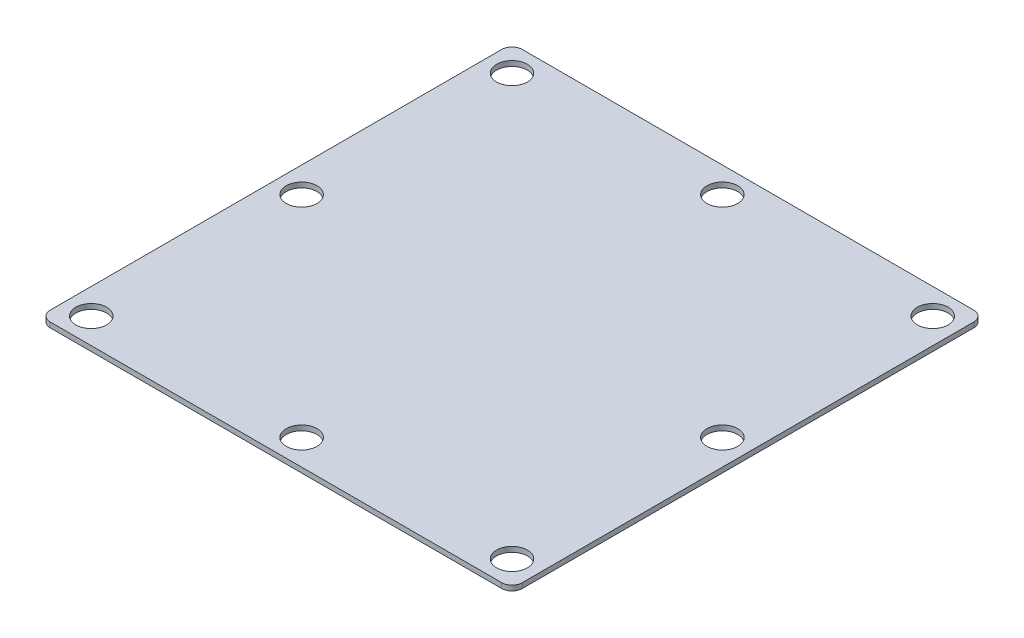
ISO-10303-21;
HEADER;
FILE_DESCRIPTION(('STEP AP214'),'2;1');
FILE_NAME('part.step','',(''),(''),'','','');
FILE_SCHEMA(('AUTOMOTIVE_DESIGN { 1 0 10303 214 1 1 1 1 }'));
ENDSEC;
DATA;
#1=APPLICATION_CONTEXT('core data for automotive mechanical design processes');
#2=APPLICATION_PROTOCOL_DEFINITION('international standard','automotive_design',2000,#1);
#3=PRODUCT_CONTEXT('',#1,'mechanical');
#4=PRODUCT('Part','Part','',(#3));
#5=PRODUCT_RELATED_PRODUCT_CATEGORY('part','',(#4));
#6=PRODUCT_DEFINITION_FORMATION('','',#4);
#7=PRODUCT_DEFINITION_CONTEXT('part definition',#1,'design');
#8=PRODUCT_DEFINITION('design','',#6,#7);
#9=PRODUCT_DEFINITION_SHAPE('','',#8);
#10=(LENGTH_UNIT() NAMED_UNIT(*) SI_UNIT(.MILLI.,.METRE.));
#11=(NAMED_UNIT(*) PLANE_ANGLE_UNIT() SI_UNIT($,.RADIAN.));
#12=(NAMED_UNIT(*) SI_UNIT($,.STERADIAN.) SOLID_ANGLE_UNIT());
#13=UNCERTAINTY_MEASURE_WITH_UNIT(LENGTH_MEASURE(1.E-05),#10,'distance_accuracy_value','');
#14=(GEOMETRIC_REPRESENTATION_CONTEXT(3) GLOBAL_UNCERTAINTY_ASSIGNED_CONTEXT((#13)) GLOBAL_UNIT_ASSIGNED_CONTEXT((#10,
#11,#12)) REPRESENTATION_CONTEXT('',''));
#15=CARTESIAN_POINT('',(0.,0.,0.));
#16=DIRECTION('',(0.,0.,1.));
#17=DIRECTION('',(1.,0.,0.));
#18=AXIS2_PLACEMENT_3D('',#15,#16,#17);
#19=CARTESIAN_POINT('',(46.,0.5,46.));
#20=DIRECTION('',(-1.,0.,0.));
#21=DIRECTION('',(0.,0.,1.));
#22=AXIS2_PLACEMENT_3D('',#19,#20,#21);
#23=PLANE('',#22);
#24=DIRECTION('',(0.,0.,-1.));
#25=VECTOR('',#24,1.);
#26=CARTESIAN_POINT('',(46.,0.5,46.));
#27=LINE('',#26,#25);
#28=CARTESIAN_POINT('',(46.,0.5,44.));
#29=VERTEX_POINT('',#28);
#30=CARTESIAN_POINT('',(46.,0.5,-44.));
#31=VERTEX_POINT('',#30);
#32=EDGE_CURVE('E118',#29,#31,#27,.T.);
#33=ORIENTED_EDGE('',*,*,#32,.F.);
#34=DIRECTION('',(0.,-1.,0.));
#35=VECTOR('',#34,1.);
#36=CARTESIAN_POINT('',(46.,0.5,44.));
#37=LINE('',#36,#35);
#38=CARTESIAN_POINT('',(46.,-0.5,44.));
#39=VERTEX_POINT('',#38);
#40=EDGE_CURVE('E103',#29,#39,#37,.T.);
#41=ORIENTED_EDGE('',*,*,#40,.T.);
#42=DIRECTION('',(0.,0.,-1.));
#43=VECTOR('',#42,1.);
#44=CARTESIAN_POINT('',(46.,-0.5,46.));
#45=LINE('',#44,#43);
#46=CARTESIAN_POINT('',(46.,-0.5,-44.));
#47=VERTEX_POINT('',#46);
#48=EDGE_CURVE('E115',#39,#47,#45,.T.);
#49=ORIENTED_EDGE('',*,*,#48,.T.);
#50=DIRECTION('',(0.,-1.,0.));
#51=VECTOR('',#50,1.);
#52=CARTESIAN_POINT('',(46.,0.5,-44.));
#53=LINE('',#52,#51);
#54=EDGE_CURVE('E120',#47,#31,#53,.F.);
#55=ORIENTED_EDGE('',*,*,#54,.T.);
#56=EDGE_LOOP('',(#33,#41,#49,#55));
#57=FACE_BOUND('',#56,.T.);
#58=ADVANCED_FACE('F33',(#57),#23,.F.);
#59=CARTESIAN_POINT('',(-46.,0.5,-46.));
#60=DIRECTION('',(0.,0.,1.));
#61=DIRECTION('',(1.,0.,0.));
#62=AXIS2_PLACEMENT_3D('',#59,#60,#61);
#63=PLANE('',#62);
#64=DIRECTION('',(-1.,0.,0.));
#65=VECTOR('',#64,1.);
#66=CARTESIAN_POINT('',(-46.,-0.5,-46.));
#67=LINE('',#66,#65);
#68=CARTESIAN_POINT('',(44.,-0.5,-46.));
#69=VERTEX_POINT('',#68);
#70=CARTESIAN_POINT('',(-44.,-0.5,-46.));
#71=VERTEX_POINT('',#70);
#72=EDGE_CURVE('E125',#69,#71,#67,.T.);
#73=ORIENTED_EDGE('',*,*,#72,.T.);
#74=DIRECTION('',(0.,-1.,0.));
#75=VECTOR('',#74,1.);
#76=CARTESIAN_POINT('',(-44.,0.5,-46.));
#77=LINE('',#76,#75);
#78=CARTESIAN_POINT('',(-44.,0.5,-46.));
#79=VERTEX_POINT('',#78);
#80=EDGE_CURVE('E11',#71,#79,#77,.F.);
#81=ORIENTED_EDGE('',*,*,#80,.T.);
#82=DIRECTION('',(-1.,0.,0.));
#83=VECTOR('',#82,1.);
#84=CARTESIAN_POINT('',(-46.,0.5,-46.));
#85=LINE('',#84,#83);
#86=CARTESIAN_POINT('',(44.,0.5,-46.));
#87=VERTEX_POINT('',#86);
#88=EDGE_CURVE('E164',#87,#79,#85,.T.);
#89=ORIENTED_EDGE('',*,*,#88,.F.);
#90=DIRECTION('',(0.,-1.,0.));
#91=VECTOR('',#90,1.);
#92=CARTESIAN_POINT('',(44.,0.5,-46.));
#93=LINE('',#92,#91);
#94=EDGE_CURVE('E41',#87,#69,#93,.T.);
#95=ORIENTED_EDGE('',*,*,#94,.T.);
#96=EDGE_LOOP('',(#73,#81,#89,#95));
#97=FACE_BOUND('',#96,.T.);
#98=ADVANCED_FACE('F162',(#97),#63,.F.);
#99=CARTESIAN_POINT('',(-46.,0.5,46.));
#100=DIRECTION('',(1.,0.,0.));
#101=DIRECTION('',(0.,0.,-1.));
#102=AXIS2_PLACEMENT_3D('',#99,#100,#101);
#103=PLANE('',#102);
#104=DIRECTION('',(0.,0.,1.));
#105=VECTOR('',#104,1.);
#106=CARTESIAN_POINT('',(-46.,0.5,46.));
#107=LINE('',#106,#105);
#108=CARTESIAN_POINT('',(-46.,0.5,-44.));
#109=VERTEX_POINT('',#108);
#110=CARTESIAN_POINT('',(-46.,0.5,44.));
#111=VERTEX_POINT('',#110);
#112=EDGE_CURVE('E172',#109,#111,#107,.T.);
#113=ORIENTED_EDGE('',*,*,#112,.F.);
#114=DIRECTION('',(0.,-1.,0.));
#115=VECTOR('',#114,1.);
#116=CARTESIAN_POINT('',(-46.,0.5,-44.));
#117=LINE('',#116,#115);
#118=CARTESIAN_POINT('',(-46.,-0.5,-44.));
#119=VERTEX_POINT('',#118);
#120=EDGE_CURVE('E156',#109,#119,#117,.T.);
#121=ORIENTED_EDGE('',*,*,#120,.T.);
#122=DIRECTION('',(0.,0.,1.));
#123=VECTOR('',#122,1.);
#124=CARTESIAN_POINT('',(-46.,-0.5,46.));
#125=LINE('',#124,#123);
#126=CARTESIAN_POINT('',(-46.,-0.5,44.));
#127=VERTEX_POINT('',#126);
#128=EDGE_CURVE('E129',#119,#127,#125,.T.);
#129=ORIENTED_EDGE('',*,*,#128,.T.);
#130=DIRECTION('',(0.,-1.,0.));
#131=VECTOR('',#130,1.);
#132=CARTESIAN_POINT('',(-46.,0.5,44.));
#133=LINE('',#132,#131);
#134=EDGE_CURVE('E48',#127,#111,#133,.F.);
#135=ORIENTED_EDGE('',*,*,#134,.T.);
#136=EDGE_LOOP('',(#113,#121,#129,#135));
#137=FACE_BOUND('',#136,.T.);
#138=ADVANCED_FACE('F171',(#137),#103,.F.);
#139=CARTESIAN_POINT('',(-46.,0.5,46.));
#140=DIRECTION('',(0.,0.,-1.));
#141=DIRECTION('',(-1.,0.,0.));
#142=AXIS2_PLACEMENT_3D('',#139,#140,#141);
#143=PLANE('',#142);
#144=DIRECTION('',(1.,0.,0.));
#145=VECTOR('',#144,1.);
#146=CARTESIAN_POINT('',(-46.,-0.5,46.));
#147=LINE('',#146,#145);
#148=CARTESIAN_POINT('',(-44.,-0.5,46.));
#149=VERTEX_POINT('',#148);
#150=CARTESIAN_POINT('',(44.,-0.5,46.));
#151=VERTEX_POINT('',#150);
#152=EDGE_CURVE('E139',#149,#151,#147,.T.);
#153=ORIENTED_EDGE('',*,*,#152,.T.);
#154=DIRECTION('',(0.,-1.,0.));
#155=VECTOR('',#154,1.);
#156=CARTESIAN_POINT('',(44.,0.5,46.));
#157=LINE('',#156,#155);
#158=CARTESIAN_POINT('',(44.,0.5,46.));
#159=VERTEX_POINT('',#158);
#160=EDGE_CURVE('E104',#151,#159,#157,.F.);
#161=ORIENTED_EDGE('',*,*,#160,.T.);
#162=DIRECTION('',(1.,0.,0.));
#163=VECTOR('',#162,1.);
#164=CARTESIAN_POINT('',(-46.,0.5,46.));
#165=LINE('',#164,#163);
#166=CARTESIAN_POINT('',(-44.,0.5,46.));
#167=VERTEX_POINT('',#166);
#168=EDGE_CURVE('E135',#167,#159,#165,.T.);
#169=ORIENTED_EDGE('',*,*,#168,.F.);
#170=DIRECTION('',(0.,-1.,0.));
#171=VECTOR('',#170,1.);
#172=CARTESIAN_POINT('',(-44.,0.5,46.));
#173=LINE('',#172,#171);
#174=EDGE_CURVE('E109',#167,#149,#173,.T.);
#175=ORIENTED_EDGE('',*,*,#174,.T.);
#176=EDGE_LOOP('',(#153,#161,#169,#175));
#177=FACE_BOUND('',#176,.T.);
#178=ADVANCED_FACE('F236',(#177),#143,.F.);
#179=CARTESIAN_POINT('',(0.,0.5,0.));
#180=DIRECTION('',(0.,-1.,0.));
#181=DIRECTION('',(0.,0.,-1.));
#182=AXIS2_PLACEMENT_3D('',#179,#180,#181);
#183=PLANE('',#182);
#184=CARTESIAN_POINT('',(0.,0.5,-41.));
#185=DIRECTION('',(0.,-1.,0.));
#186=DIRECTION('',(0.,0.,-1.));
#187=AXIS2_PLACEMENT_3D('',#184,#185,#186);
#188=CIRCLE('',#187,3.);
#189=CARTESIAN_POINT('',(0.,0.5,-44.));
#190=VERTEX_POINT('',#189);
#191=EDGE_CURVE('E126',#190,#190,#188,.T.);
#192=ORIENTED_EDGE('',*,*,#191,.T.);
#193=EDGE_LOOP('',(#192));
#194=FACE_BOUND('',#193,.T.);
#195=CARTESIAN_POINT('',(41.,0.5,-41.));
#196=DIRECTION('',(0.,-1.,0.));
#197=DIRECTION('',(0.,0.,-1.));
#198=AXIS2_PLACEMENT_3D('',#195,#196,#197);
#199=CIRCLE('',#198,3.);
#200=CARTESIAN_POINT('',(41.,0.5,-44.));
#201=VERTEX_POINT('',#200);
#202=EDGE_CURVE('E132',#201,#201,#199,.T.);
#203=ORIENTED_EDGE('',*,*,#202,.T.);
#204=EDGE_LOOP('',(#203));
#205=FACE_BOUND('',#204,.T.);
#206=CARTESIAN_POINT('',(41.,0.5,0.));
#207=DIRECTION('',(0.,-1.,0.));
#208=DIRECTION('',(0.,0.,-1.));
#209=AXIS2_PLACEMENT_3D('',#206,#207,#208);
#210=CIRCLE('',#209,3.);
#211=CARTESIAN_POINT('',(41.,0.5,-3.));
#212=VERTEX_POINT('',#211);
#213=EDGE_CURVE('E180',#212,#212,#210,.T.);
#214=ORIENTED_EDGE('',*,*,#213,.T.);
#215=EDGE_LOOP('',(#214));
#216=FACE_BOUND('',#215,.T.);
#217=CARTESIAN_POINT('',(41.,0.5,41.));
#218=DIRECTION('',(0.,-1.,0.));
#219=DIRECTION('',(0.,0.,-1.));
#220=AXIS2_PLACEMENT_3D('',#217,#218,#219);
#221=CIRCLE('',#220,3.);
#222=CARTESIAN_POINT('',(41.,0.5,38.));
#223=VERTEX_POINT('',#222);
#224=EDGE_CURVE('E183',#223,#223,#221,.T.);
#225=ORIENTED_EDGE('',*,*,#224,.T.);
#226=EDGE_LOOP('',(#225));
#227=FACE_BOUND('',#226,.T.);
#228=CARTESIAN_POINT('',(0.,0.5,41.));
#229=DIRECTION('',(0.,-1.,0.));
#230=DIRECTION('',(0.,0.,-1.));
#231=AXIS2_PLACEMENT_3D('',#228,#229,#230);
#232=CIRCLE('',#231,3.);
#233=CARTESIAN_POINT('',(0.,0.5,38.));
#234=VERTEX_POINT('',#233);
#235=EDGE_CURVE('E186',#234,#234,#232,.T.);
#236=ORIENTED_EDGE('',*,*,#235,.T.);
#237=EDGE_LOOP('',(#236));
#238=FACE_BOUND('',#237,.T.);
#239=CARTESIAN_POINT('',(-41.,0.5,41.));
#240=DIRECTION('',(0.,-1.,0.));
#241=DIRECTION('',(0.,0.,-1.));
#242=AXIS2_PLACEMENT_3D('',#239,#240,#241);
#243=CIRCLE('',#242,3.);
#244=CARTESIAN_POINT('',(-41.,0.5,38.));
#245=VERTEX_POINT('',#244);
#246=EDGE_CURVE('E189',#245,#245,#243,.T.);
#247=ORIENTED_EDGE('',*,*,#246,.T.);
#248=EDGE_LOOP('',(#247));
#249=FACE_BOUND('',#248,.T.);
#250=CARTESIAN_POINT('',(-41.,0.5,0.));
#251=DIRECTION('',(0.,-1.,0.));
#252=DIRECTION('',(0.,0.,-1.));
#253=AXIS2_PLACEMENT_3D('',#250,#251,#252);
#254=CIRCLE('',#253,3.);
#255=CARTESIAN_POINT('',(-41.,0.5,-3.));
#256=VERTEX_POINT('',#255);
#257=EDGE_CURVE('E192',#256,#256,#254,.T.);
#258=ORIENTED_EDGE('',*,*,#257,.T.);
#259=EDGE_LOOP('',(#258));
#260=FACE_BOUND('',#259,.T.);
#261=CARTESIAN_POINT('',(-41.,0.5,-41.));
#262=DIRECTION('',(0.,-1.,0.));
#263=DIRECTION('',(0.,0.,-1.));
#264=AXIS2_PLACEMENT_3D('',#261,#262,#263);
#265=CIRCLE('',#264,3.);
#266=CARTESIAN_POINT('',(-41.,0.5,-44.));
#267=VERTEX_POINT('',#266);
#268=EDGE_CURVE('E195',#267,#267,#265,.T.);
#269=ORIENTED_EDGE('',*,*,#268,.T.);
#270=EDGE_LOOP('',(#269));
#271=FACE_BOUND('',#270,.T.);
#272=ORIENTED_EDGE('',*,*,#168,.T.);
#273=CARTESIAN_POINT('',(44.,0.5,44.));
#274=DIRECTION('',(0.,-1.,0.));
#275=DIRECTION('',(0.,0.,-1.));
#276=AXIS2_PLACEMENT_3D('',#273,#274,#275);
#277=CIRCLE('',#276,2.);
#278=EDGE_CURVE('E153',#159,#29,#277,.F.);
#279=ORIENTED_EDGE('',*,*,#278,.T.);
#280=ORIENTED_EDGE('',*,*,#32,.T.);
#281=CARTESIAN_POINT('',(44.,0.5,-44.));
#282=DIRECTION('',(0.,-1.,0.));
#283=DIRECTION('',(0.,0.,-1.));
#284=AXIS2_PLACEMENT_3D('',#281,#282,#283);
#285=CIRCLE('',#284,2.);
#286=EDGE_CURVE('E150',#31,#87,#285,.F.);
#287=ORIENTED_EDGE('',*,*,#286,.T.);
#288=ORIENTED_EDGE('',*,*,#88,.T.);
#289=CARTESIAN_POINT('',(-44.,0.5,-44.));
#290=DIRECTION('',(0.,-1.,0.));
#291=DIRECTION('',(0.,0.,-1.));
#292=AXIS2_PLACEMENT_3D('',#289,#290,#291);
#293=CIRCLE('',#292,2.);
#294=EDGE_CURVE('E55',#79,#109,#293,.F.);
#295=ORIENTED_EDGE('',*,*,#294,.T.);
#296=ORIENTED_EDGE('',*,*,#112,.T.);
#297=CARTESIAN_POINT('',(-44.,0.5,44.));
#298=DIRECTION('',(0.,-1.,0.));
#299=DIRECTION('',(0.,0.,-1.));
#300=AXIS2_PLACEMENT_3D('',#297,#298,#299);
#301=CIRCLE('',#300,2.);
#302=EDGE_CURVE('E148',#111,#167,#301,.F.);
#303=ORIENTED_EDGE('',*,*,#302,.T.);
#304=EDGE_LOOP('',(#272,#279,#280,#287,#288,#295,#296,#303));
#305=FACE_BOUND('',#304,.T.);
#306=ADVANCED_FACE('F233',(#194,#205,#216,#227,#238,#249,#260,#271,#305),#183,.F.);
#307=CARTESIAN_POINT('',(0.,-0.5,0.));
#308=DIRECTION('',(0.,-1.,0.));
#309=DIRECTION('',(0.,0.,-1.));
#310=AXIS2_PLACEMENT_3D('',#307,#308,#309);
#311=PLANE('',#310);
#312=CARTESIAN_POINT('',(0.,-0.5,-41.));
#313=DIRECTION('',(0.,1.,0.));
#314=DIRECTION('',(0.,0.,1.));
#315=AXIS2_PLACEMENT_3D('',#312,#313,#314);
#316=CIRCLE('',#315,3.);
#317=CARTESIAN_POINT('',(0.,-0.5,-38.));
#318=VERTEX_POINT('',#317);
#319=EDGE_CURVE('E201',#318,#318,#316,.T.);
#320=ORIENTED_EDGE('',*,*,#319,.T.);
#321=EDGE_LOOP('',(#320));
#322=FACE_BOUND('',#321,.T.);
#323=CARTESIAN_POINT('',(41.,-0.5,-41.));
#324=DIRECTION('',(0.,1.,0.));
#325=DIRECTION('',(0.,0.,1.));
#326=AXIS2_PLACEMENT_3D('',#323,#324,#325);
#327=CIRCLE('',#326,3.);
#328=CARTESIAN_POINT('',(41.,-0.5,-38.));
#329=VERTEX_POINT('',#328);
#330=EDGE_CURVE('E209',#329,#329,#327,.T.);
#331=ORIENTED_EDGE('',*,*,#330,.T.);
#332=EDGE_LOOP('',(#331));
#333=FACE_BOUND('',#332,.T.);
#334=CARTESIAN_POINT('',(41.,-0.5,0.));
#335=DIRECTION('',(0.,1.,0.));
#336=DIRECTION('',(0.,0.,1.));
#337=AXIS2_PLACEMENT_3D('',#334,#335,#336);
#338=CIRCLE('',#337,3.);
#339=CARTESIAN_POINT('',(41.,-0.5,3.));
#340=VERTEX_POINT('',#339);
#341=EDGE_CURVE('E205',#340,#340,#338,.T.);
#342=ORIENTED_EDGE('',*,*,#341,.T.);
#343=EDGE_LOOP('',(#342));
#344=FACE_BOUND('',#343,.T.);
#345=CARTESIAN_POINT('',(41.,-0.5,41.));
#346=DIRECTION('',(0.,1.,0.));
#347=DIRECTION('',(0.,0.,1.));
#348=AXIS2_PLACEMENT_3D('',#345,#346,#347);
#349=CIRCLE('',#348,3.);
#350=CARTESIAN_POINT('',(41.,-0.5,44.));
#351=VERTEX_POINT('',#350);
#352=EDGE_CURVE('E202',#351,#351,#349,.T.);
#353=ORIENTED_EDGE('',*,*,#352,.T.);
#354=EDGE_LOOP('',(#353));
#355=FACE_BOUND('',#354,.T.);
#356=CARTESIAN_POINT('',(0.,-0.5,41.));
#357=DIRECTION('',(0.,1.,0.));
#358=DIRECTION('',(0.,0.,1.));
#359=AXIS2_PLACEMENT_3D('',#356,#357,#358);
#360=CIRCLE('',#359,3.);
#361=CARTESIAN_POINT('',(0.,-0.5,44.));
#362=VERTEX_POINT('',#361);
#363=EDGE_CURVE('E206',#362,#362,#360,.T.);
#364=ORIENTED_EDGE('',*,*,#363,.T.);
#365=EDGE_LOOP('',(#364));
#366=FACE_BOUND('',#365,.T.);
#367=CARTESIAN_POINT('',(-41.,-0.5,41.));
#368=DIRECTION('',(0.,1.,0.));
#369=DIRECTION('',(0.,0.,1.));
#370=AXIS2_PLACEMENT_3D('',#367,#368,#369);
#371=CIRCLE('',#370,3.);
#372=CARTESIAN_POINT('',(-41.,-0.5,44.));
#373=VERTEX_POINT('',#372);
#374=EDGE_CURVE('E217',#373,#373,#371,.T.);
#375=ORIENTED_EDGE('',*,*,#374,.T.);
#376=EDGE_LOOP('',(#375));
#377=FACE_BOUND('',#376,.T.);
#378=CARTESIAN_POINT('',(-41.,-0.5,0.));
#379=DIRECTION('',(0.,1.,0.));
#380=DIRECTION('',(0.,0.,1.));
#381=AXIS2_PLACEMENT_3D('',#378,#379,#380);
#382=CIRCLE('',#381,3.);
#383=CARTESIAN_POINT('',(-41.,-0.5,3.));
#384=VERTEX_POINT('',#383);
#385=EDGE_CURVE('E214',#384,#384,#382,.T.);
#386=ORIENTED_EDGE('',*,*,#385,.T.);
#387=EDGE_LOOP('',(#386));
#388=FACE_BOUND('',#387,.T.);
#389=CARTESIAN_POINT('',(-41.,-0.5,-41.));
#390=DIRECTION('',(0.,1.,0.));
#391=DIRECTION('',(0.,0.,1.));
#392=AXIS2_PLACEMENT_3D('',#389,#390,#391);
#393=CIRCLE('',#392,3.);
#394=CARTESIAN_POINT('',(-41.,-0.5,-38.));
#395=VERTEX_POINT('',#394);
#396=EDGE_CURVE('E198',#395,#395,#393,.T.);
#397=ORIENTED_EDGE('',*,*,#396,.T.);
#398=EDGE_LOOP('',(#397));
#399=FACE_BOUND('',#398,.T.);
#400=ORIENTED_EDGE('',*,*,#48,.F.);
#401=CARTESIAN_POINT('',(44.,-0.5,44.));
#402=DIRECTION('',(0.,-1.,0.));
#403=DIRECTION('',(0.,0.,-1.));
#404=AXIS2_PLACEMENT_3D('',#401,#402,#403);
#405=CIRCLE('',#404,2.);
#406=EDGE_CURVE('E99',#39,#151,#405,.T.);
#407=ORIENTED_EDGE('',*,*,#406,.T.);
#408=ORIENTED_EDGE('',*,*,#152,.F.);
#409=CARTESIAN_POINT('',(-44.,-0.5,44.));
#410=DIRECTION('',(0.,-1.,0.));
#411=DIRECTION('',(0.,0.,-1.));
#412=AXIS2_PLACEMENT_3D('',#409,#410,#411);
#413=CIRCLE('',#412,2.);
#414=EDGE_CURVE('E119',#149,#127,#413,.T.);
#415=ORIENTED_EDGE('',*,*,#414,.T.);
#416=ORIENTED_EDGE('',*,*,#128,.F.);
#417=CARTESIAN_POINT('',(-44.,-0.5,-44.));
#418=DIRECTION('',(0.,-1.,0.));
#419=DIRECTION('',(0.,0.,-1.));
#420=AXIS2_PLACEMENT_3D('',#417,#418,#419);
#421=CIRCLE('',#420,2.);
#422=EDGE_CURVE('E110',#119,#71,#421,.T.);
#423=ORIENTED_EDGE('',*,*,#422,.T.);
#424=ORIENTED_EDGE('',*,*,#72,.F.);
#425=CARTESIAN_POINT('',(44.,-0.5,-44.));
#426=DIRECTION('',(0.,-1.,0.));
#427=DIRECTION('',(0.,0.,-1.));
#428=AXIS2_PLACEMENT_3D('',#425,#426,#427);
#429=CIRCLE('',#428,2.);
#430=EDGE_CURVE('E124',#69,#47,#429,.T.);
#431=ORIENTED_EDGE('',*,*,#430,.T.);
#432=EDGE_LOOP('',(#400,#407,#408,#415,#416,#423,#424,#431));
#433=FACE_BOUND('',#432,.T.);
#434=ADVANCED_FACE('F122',(#322,#333,#344,#355,#366,#377,#388,#399,#433),#311,.T.);
#435=CARTESIAN_POINT('',(44.,0.5,44.));
#436=DIRECTION('',(0.,-1.,0.));
#437=DIRECTION('',(0.,0.,-1.));
#438=AXIS2_PLACEMENT_3D('',#435,#436,#437);
#439=CYLINDRICAL_SURFACE('',#438,2.);
#440=ORIENTED_EDGE('',*,*,#278,.F.);
#441=ORIENTED_EDGE('',*,*,#160,.F.);
#442=ORIENTED_EDGE('',*,*,#406,.F.);
#443=ORIENTED_EDGE('',*,*,#40,.F.);
#444=EDGE_LOOP('',(#440,#441,#442,#443));
#445=FACE_BOUND('',#444,.T.);
#446=ADVANCED_FACE('F102',(#445),#439,.T.);
#447=CARTESIAN_POINT('',(-44.,0.5,-44.));
#448=DIRECTION('',(0.,-1.,0.));
#449=DIRECTION('',(0.,0.,-1.));
#450=AXIS2_PLACEMENT_3D('',#447,#448,#449);
#451=CYLINDRICAL_SURFACE('',#450,2.);
#452=ORIENTED_EDGE('',*,*,#294,.F.);
#453=ORIENTED_EDGE('',*,*,#80,.F.);
#454=ORIENTED_EDGE('',*,*,#422,.F.);
#455=ORIENTED_EDGE('',*,*,#120,.F.);
#456=EDGE_LOOP('',(#452,#453,#454,#455));
#457=FACE_BOUND('',#456,.T.);
#458=ADVANCED_FACE('F170',(#457),#451,.T.);
#459=CARTESIAN_POINT('',(44.,0.5,-44.));
#460=DIRECTION('',(0.,-1.,0.));
#461=DIRECTION('',(0.,0.,-1.));
#462=AXIS2_PLACEMENT_3D('',#459,#460,#461);
#463=CYLINDRICAL_SURFACE('',#462,2.);
#464=ORIENTED_EDGE('',*,*,#286,.F.);
#465=ORIENTED_EDGE('',*,*,#54,.F.);
#466=ORIENTED_EDGE('',*,*,#430,.F.);
#467=ORIENTED_EDGE('',*,*,#94,.F.);
#468=EDGE_LOOP('',(#464,#465,#466,#467));
#469=FACE_BOUND('',#468,.T.);
#470=ADVANCED_FACE('F250',(#469),#463,.T.);
#471=CARTESIAN_POINT('',(-44.,0.5,44.));
#472=DIRECTION('',(0.,-1.,0.));
#473=DIRECTION('',(0.,0.,-1.));
#474=AXIS2_PLACEMENT_3D('',#471,#472,#473);
#475=CYLINDRICAL_SURFACE('',#474,2.);
#476=ORIENTED_EDGE('',*,*,#302,.F.);
#477=ORIENTED_EDGE('',*,*,#134,.F.);
#478=ORIENTED_EDGE('',*,*,#414,.F.);
#479=ORIENTED_EDGE('',*,*,#174,.F.);
#480=EDGE_LOOP('',(#476,#477,#478,#479));
#481=FACE_BOUND('',#480,.T.);
#482=ADVANCED_FACE('F35',(#481),#475,.T.);
#483=CARTESIAN_POINT('',(-41.,-0.5,-41.));
#484=DIRECTION('',(0.,1.,0.));
#485=DIRECTION('',(0.,0.,1.));
#486=AXIS2_PLACEMENT_3D('',#483,#484,#485);
#487=CYLINDRICAL_SURFACE('',#486,3.);
#488=ORIENTED_EDGE('',*,*,#396,.F.);
#489=EDGE_LOOP('',(#488));
#490=FACE_BOUND('',#489,.T.);
#491=ORIENTED_EDGE('',*,*,#268,.F.);
#492=EDGE_LOOP('',(#491));
#493=FACE_BOUND('',#492,.T.);
#494=ADVANCED_FACE('F249',(#490,#493),#487,.F.);
#495=CARTESIAN_POINT('',(-41.,-0.5,0.));
#496=DIRECTION('',(0.,1.,0.));
#497=DIRECTION('',(0.,0.,1.));
#498=AXIS2_PLACEMENT_3D('',#495,#496,#497);
#499=CYLINDRICAL_SURFACE('',#498,3.);
#500=ORIENTED_EDGE('',*,*,#385,.F.);
#501=EDGE_LOOP('',(#500));
#502=FACE_BOUND('',#501,.T.);
#503=ORIENTED_EDGE('',*,*,#257,.F.);
#504=EDGE_LOOP('',(#503));
#505=FACE_BOUND('',#504,.T.);
#506=ADVANCED_FACE('F255',(#502,#505),#499,.F.);
#507=CARTESIAN_POINT('',(-41.,-0.5,41.));
#508=DIRECTION('',(0.,1.,0.));
#509=DIRECTION('',(0.,0.,1.));
#510=AXIS2_PLACEMENT_3D('',#507,#508,#509);
#511=CYLINDRICAL_SURFACE('',#510,3.);
#512=ORIENTED_EDGE('',*,*,#374,.F.);
#513=EDGE_LOOP('',(#512));
#514=FACE_BOUND('',#513,.T.);
#515=ORIENTED_EDGE('',*,*,#246,.F.);
#516=EDGE_LOOP('',(#515));
#517=FACE_BOUND('',#516,.T.);
#518=ADVANCED_FACE('F229',(#514,#517),#511,.F.);
#519=CARTESIAN_POINT('',(0.,-0.5,41.));
#520=DIRECTION('',(0.,1.,0.));
#521=DIRECTION('',(0.,0.,1.));
#522=AXIS2_PLACEMENT_3D('',#519,#520,#521);
#523=CYLINDRICAL_SURFACE('',#522,3.);
#524=ORIENTED_EDGE('',*,*,#363,.F.);
#525=EDGE_LOOP('',(#524));
#526=FACE_BOUND('',#525,.T.);
#527=ORIENTED_EDGE('',*,*,#235,.F.);
#528=EDGE_LOOP('',(#527));
#529=FACE_BOUND('',#528,.T.);
#530=ADVANCED_FACE('F225',(#526,#529),#523,.F.);
#531=CARTESIAN_POINT('',(41.,-0.5,41.));
#532=DIRECTION('',(0.,1.,0.));
#533=DIRECTION('',(0.,0.,1.));
#534=AXIS2_PLACEMENT_3D('',#531,#532,#533);
#535=CYLINDRICAL_SURFACE('',#534,3.);
#536=ORIENTED_EDGE('',*,*,#352,.F.);
#537=EDGE_LOOP('',(#536));
#538=FACE_BOUND('',#537,.T.);
#539=ORIENTED_EDGE('',*,*,#224,.F.);
#540=EDGE_LOOP('',(#539));
#541=FACE_BOUND('',#540,.T.);
#542=ADVANCED_FACE('F228',(#538,#541),#535,.F.);
#543=CARTESIAN_POINT('',(41.,-0.5,0.));
#544=DIRECTION('',(0.,1.,0.));
#545=DIRECTION('',(0.,0.,1.));
#546=AXIS2_PLACEMENT_3D('',#543,#544,#545);
#547=CYLINDRICAL_SURFACE('',#546,3.);
#548=ORIENTED_EDGE('',*,*,#341,.F.);
#549=EDGE_LOOP('',(#548));
#550=FACE_BOUND('',#549,.T.);
#551=ORIENTED_EDGE('',*,*,#213,.F.);
#552=EDGE_LOOP('',(#551));
#553=FACE_BOUND('',#552,.T.);
#554=ADVANCED_FACE('F332',(#550,#553),#547,.F.);
#555=CARTESIAN_POINT('',(41.,-0.5,-41.));
#556=DIRECTION('',(0.,1.,0.));
#557=DIRECTION('',(0.,0.,1.));
#558=AXIS2_PLACEMENT_3D('',#555,#556,#557);
#559=CYLINDRICAL_SURFACE('',#558,3.);
#560=ORIENTED_EDGE('',*,*,#330,.F.);
#561=EDGE_LOOP('',(#560));
#562=FACE_BOUND('',#561,.T.);
#563=ORIENTED_EDGE('',*,*,#202,.F.);
#564=EDGE_LOOP('',(#563));
#565=FACE_BOUND('',#564,.T.);
#566=ADVANCED_FACE('F342',(#562,#565),#559,.F.);
#567=CARTESIAN_POINT('',(0.,-0.5,-41.));
#568=DIRECTION('',(0.,1.,0.));
#569=DIRECTION('',(0.,0.,1.));
#570=AXIS2_PLACEMENT_3D('',#567,#568,#569);
#571=CYLINDRICAL_SURFACE('',#570,3.);
#572=ORIENTED_EDGE('',*,*,#319,.F.);
#573=EDGE_LOOP('',(#572));
#574=FACE_BOUND('',#573,.T.);
#575=ORIENTED_EDGE('',*,*,#191,.F.);
#576=EDGE_LOOP('',(#575));
#577=FACE_BOUND('',#576,.T.);
#578=ADVANCED_FACE('F352',(#574,#577),#571,.F.);
#579=CLOSED_SHELL('',(#58,#98,#138,#178,#306,#434,#446,#458,#470,#482,#494,#506,#518,#530,#542,
#554,#566,#578));
#580=MANIFOLD_SOLID_BREP('B2',#579);
#581=ADVANCED_BREP_SHAPE_REPRESENTATION('',(#18,#580),#14);
#582=SHAPE_DEFINITION_REPRESENTATION(#9,#581);
ENDSEC;
END-ISO-10303-21;
